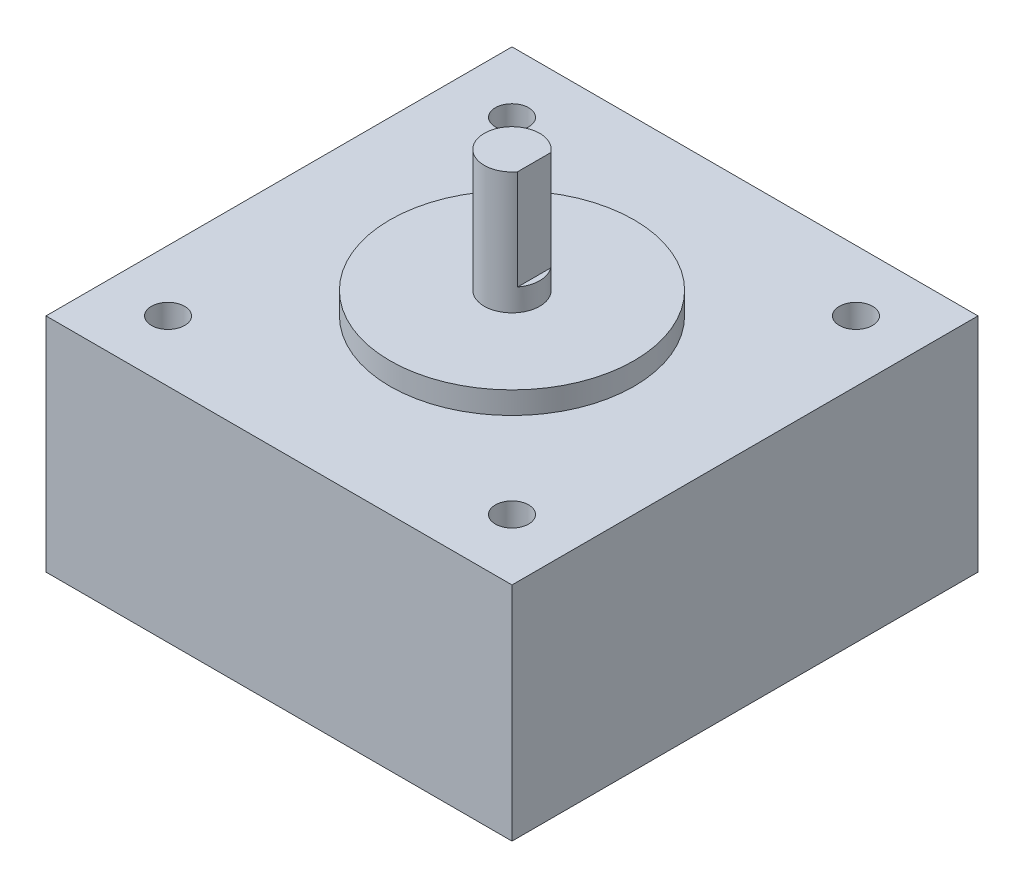
ISO-10303-21;
HEADER;
FILE_DESCRIPTION(('STEP AP214'),'2;1');
FILE_NAME('part.step','',(''),(''),'','','');
FILE_SCHEMA(('AUTOMOTIVE_DESIGN { 1 0 10303 214 1 1 1 1 }'));
ENDSEC;
DATA;
#1=APPLICATION_CONTEXT('core data for automotive mechanical design processes');
#2=APPLICATION_PROTOCOL_DEFINITION('international standard','automotive_design',2000,#1);
#3=PRODUCT_CONTEXT('',#1,'mechanical');
#4=PRODUCT('Part','Part','',(#3));
#5=PRODUCT_RELATED_PRODUCT_CATEGORY('part','',(#4));
#6=PRODUCT_DEFINITION_FORMATION('','',#4);
#7=PRODUCT_DEFINITION_CONTEXT('part definition',#1,'design');
#8=PRODUCT_DEFINITION('design','',#6,#7);
#9=PRODUCT_DEFINITION_SHAPE('','',#8);
#10=(LENGTH_UNIT() NAMED_UNIT(*) SI_UNIT(.MILLI.,.METRE.));
#11=(NAMED_UNIT(*) PLANE_ANGLE_UNIT() SI_UNIT($,.RADIAN.));
#12=(NAMED_UNIT(*) SI_UNIT($,.STERADIAN.) SOLID_ANGLE_UNIT());
#13=UNCERTAINTY_MEASURE_WITH_UNIT(LENGTH_MEASURE(1.E-05),#10,'distance_accuracy_value','');
#14=(GEOMETRIC_REPRESENTATION_CONTEXT(3) GLOBAL_UNCERTAINTY_ASSIGNED_CONTEXT((#13)) GLOBAL_UNIT_ASSIGNED_CONTEXT((#10,
#11,#12)) REPRESENTATION_CONTEXT('',''));
#15=CARTESIAN_POINT('',(0.,0.,0.));
#16=DIRECTION('',(0.,0.,1.));
#17=DIRECTION('',(1.,0.,0.));
#18=AXIS2_PLACEMENT_3D('',#15,#16,#17);
#19=CARTESIAN_POINT('',(21.0000000000001,33.0000000000003,-21.));
#20=DIRECTION('',(0.,-1.,0.));
#21=DIRECTION('',(0.,0.,-1.));
#22=AXIS2_PLACEMENT_3D('',#19,#20,#21);
#23=CYLINDRICAL_SURFACE('',#22,2.5);
#24=CARTESIAN_POINT('',(20.9999999999997,22.0000000000003,-21.));
#25=DIRECTION('',(0.,1.,0.));
#26=DIRECTION('',(0.,0.,1.));
#27=AXIS2_PLACEMENT_3D('',#24,#25,#26);
#28=CIRCLE('',#27,2.5);
#29=CARTESIAN_POINT('',(20.9999999999997,22.0000000000003,-18.5));
#30=VERTEX_POINT('',#29);
#31=EDGE_CURVE('E11',#30,#30,#28,.T.);
#32=ORIENTED_EDGE('',*,*,#31,.T.);
#33=EDGE_LOOP('',(#32));
#34=FACE_BOUND('',#33,.T.);
#35=DIRECTION('',(0.,1.,0.));
#36=VECTOR('',#35,1.);
#37=CARTESIAN_POINT('',(22.9999999999997,24.0000000000001,-19.4999999999999));
#38=LINE('',#37,#36);
#39=CARTESIAN_POINT('',(22.9999999999997,24.0000000000001,-19.4999999999999));
#40=VERTEX_POINT('',#39);
#41=CARTESIAN_POINT('',(23.0000000000004,33.0000000000003,-19.5000000000001));
#42=VERTEX_POINT('',#41);
#43=EDGE_CURVE('E101',#40,#42,#38,.T.);
#44=ORIENTED_EDGE('',*,*,#43,.T.);
#45=CARTESIAN_POINT('',(21.0000000000001,33.0000000000003,-21.));
#46=DIRECTION('',(0.,1.,0.));
#47=DIRECTION('',(0.,0.,1.));
#48=AXIS2_PLACEMENT_3D('',#45,#46,#47);
#49=CIRCLE('',#48,2.5);
#50=CARTESIAN_POINT('',(23.,33.,-22.5));
#51=VERTEX_POINT('',#50);
#52=EDGE_CURVE('E119',#51,#42,#49,.T.);
#53=ORIENTED_EDGE('',*,*,#52,.F.);
#54=DIRECTION('',(0.,1.,0.));
#55=VECTOR('',#54,1.);
#56=CARTESIAN_POINT('',(23.0000000000005,24.0000000000002,-22.5));
#57=LINE('',#56,#55);
#58=CARTESIAN_POINT('',(23.0000000000005,24.0000000000002,-22.5));
#59=VERTEX_POINT('',#58);
#60=EDGE_CURVE('E55',#59,#51,#57,.T.);
#61=ORIENTED_EDGE('',*,*,#60,.F.);
#62=CARTESIAN_POINT('',(21.,24.0000000000004,-21.));
#63=DIRECTION('',(0.,1.,0.));
#64=DIRECTION('',(0.,0.,1.));
#65=AXIS2_PLACEMENT_3D('',#62,#63,#64);
#66=CIRCLE('',#65,2.5);
#67=EDGE_CURVE('E111',#40,#59,#66,.T.);
#68=ORIENTED_EDGE('',*,*,#67,.F.);
#69=EDGE_LOOP('',(#44,#53,#61,#68));
#70=FACE_BOUND('',#69,.T.);
#71=ADVANCED_FACE('F38',(#34,#70),#23,.T.);
#72=CARTESIAN_POINT('',(21.0000000000001,33.0000000000003,-21.));
#73=DIRECTION('',(0.,1.,0.));
#74=DIRECTION('',(0.,0.,1.));
#75=AXIS2_PLACEMENT_3D('',#72,#73,#74);
#76=PLANE('',#75);
#77=ORIENTED_EDGE('',*,*,#52,.T.);
#78=DIRECTION('',(0.,0.,-1.));
#79=VECTOR('',#78,1.);
#80=CARTESIAN_POINT('',(22.9999999999998,33.0000000000001,0.));
#81=LINE('',#80,#79);
#82=EDGE_CURVE('E106',#42,#51,#81,.T.);
#83=ORIENTED_EDGE('',*,*,#82,.T.);
#84=EDGE_LOOP('',(#77,#83));
#85=FACE_BOUND('',#84,.T.);
#86=ADVANCED_FACE('F187',(#85),#76,.T.);
#87=CARTESIAN_POINT('',(3.60822483003176E-13,20.0000000000001,1.80411241501588E-13));
#88=DIRECTION('',(0.,-1.,0.));
#89=DIRECTION('',(0.,0.,-1.));
#90=AXIS2_PLACEMENT_3D('',#87,#88,#89);
#91=PLANE('',#90);
#92=CARTESIAN_POINT('',(21.0000000000001,20.0000000000003,-21.0000000000002));
#93=DIRECTION('',(0.,1.,0.));
#94=DIRECTION('',(0.,0.,1.));
#95=AXIS2_PLACEMENT_3D('',#92,#93,#94);
#96=CIRCLE('',#95,11.);
#97=CARTESIAN_POINT('',(21.0000000000001,20.0000000000003,-10.0000000000002));
#98=VERTEX_POINT('',#97);
#99=EDGE_CURVE('E47',#98,#98,#96,.T.);
#100=ORIENTED_EDGE('',*,*,#99,.F.);
#101=EDGE_LOOP('',(#100));
#102=FACE_BOUND('',#101,.T.);
#103=DIRECTION('',(0.,0.,1.));
#104=VECTOR('',#103,1.);
#105=CARTESIAN_POINT('',(3.60822483003176E-13,20.0000000000001,1.80411241501588E-13));
#106=LINE('',#105,#104);
#107=CARTESIAN_POINT('',(-3.88578058618805E-13,20.0000000000002,-42.0000000000002));
#108=VERTEX_POINT('',#107);
#109=CARTESIAN_POINT('',(3.60822483003176E-13,20.0000000000001,1.80411241501588E-13));
#110=VERTEX_POINT('',#109);
#111=EDGE_CURVE('E152',#108,#110,#106,.T.);
#112=ORIENTED_EDGE('',*,*,#111,.T.);
#113=DIRECTION('',(0.999999999999994,0.,0.));
#114=VECTOR('',#113,1.);
#115=CARTESIAN_POINT('',(3.60822483003176E-13,20.0000000000001,1.80411241501588E-13));
#116=LINE('',#115,#114);
#117=CARTESIAN_POINT('',(41.9999999999997,20.0000000000001,1.2490009027033E-13));
#118=VERTEX_POINT('',#117);
#119=EDGE_CURVE('E93',#110,#118,#116,.T.);
#120=ORIENTED_EDGE('',*,*,#119,.T.);
#121=DIRECTION('',(0.,0.,-1.));
#122=VECTOR('',#121,1.);
#123=CARTESIAN_POINT('',(41.9999999999997,20.0000000000001,1.2490009027033E-13));
#124=LINE('',#123,#122);
#125=CARTESIAN_POINT('',(42.0000000000002,20.0000000000003,-42.0000000000001));
#126=VERTEX_POINT('',#125);
#127=EDGE_CURVE('E155',#118,#126,#124,.T.);
#128=ORIENTED_EDGE('',*,*,#127,.T.);
#129=DIRECTION('',(-0.999999999999994,0.,0.));
#130=VECTOR('',#129,1.);
#131=CARTESIAN_POINT('',(-3.88578058618805E-13,20.0000000000002,-42.0000000000002));
#132=LINE('',#131,#130);
#133=EDGE_CURVE('E64',#126,#108,#132,.T.);
#134=ORIENTED_EDGE('',*,*,#133,.T.);
#135=EDGE_LOOP('',(#112,#120,#128,#134));
#136=FACE_BOUND('',#135,.T.);
#137=CARTESIAN_POINT('',(36.4999999999996,20.0000000000002,-5.49999999999999));
#138=DIRECTION('',(0.,1.,0.));
#139=DIRECTION('',(0.,0.,1.));
#140=AXIS2_PLACEMENT_3D('',#137,#138,#139);
#141=CIRCLE('',#140,1.5);
#142=CARTESIAN_POINT('',(36.4999999999996,20.0000000000002,-3.99999999999999));
#143=VERTEX_POINT('',#142);
#144=EDGE_CURVE('E146',#143,#143,#141,.T.);
#145=ORIENTED_EDGE('',*,*,#144,.F.);
#146=EDGE_LOOP('',(#145));
#147=FACE_BOUND('',#146,.T.);
#148=CARTESIAN_POINT('',(36.4999999999999,20.0000000000002,-36.5000000000002));
#149=DIRECTION('',(0.,1.,0.));
#150=DIRECTION('',(0.,0.,1.));
#151=AXIS2_PLACEMENT_3D('',#148,#149,#150);
#152=CIRCLE('',#151,1.5);
#153=CARTESIAN_POINT('',(36.4999999999999,20.0000000000002,-35.0000000000002));
#154=VERTEX_POINT('',#153);
#155=EDGE_CURVE('E140',#154,#154,#152,.T.);
#156=ORIENTED_EDGE('',*,*,#155,.F.);
#157=EDGE_LOOP('',(#156));
#158=FACE_BOUND('',#157,.T.);
#159=CARTESIAN_POINT('',(5.49999999999987,20.0000000000003,-5.49999999999999));
#160=DIRECTION('',(0.,1.,0.));
#161=DIRECTION('',(0.,0.,1.));
#162=AXIS2_PLACEMENT_3D('',#159,#160,#161);
#163=CIRCLE('',#162,1.5);
#164=CARTESIAN_POINT('',(5.49999999999987,20.0000000000003,-3.99999999999999));
#165=VERTEX_POINT('',#164);
#166=EDGE_CURVE('E134',#165,#165,#163,.T.);
#167=ORIENTED_EDGE('',*,*,#166,.F.);
#168=EDGE_LOOP('',(#167));
#169=FACE_BOUND('',#168,.T.);
#170=CARTESIAN_POINT('',(5.50000000000001,20.0000000000002,-36.5));
#171=DIRECTION('',(0.,1.,0.));
#172=DIRECTION('',(0.,0.,1.));
#173=AXIS2_PLACEMENT_3D('',#170,#171,#172);
#174=CIRCLE('',#173,1.5);
#175=CARTESIAN_POINT('',(5.50000000000001,20.0000000000002,-35.));
#176=VERTEX_POINT('',#175);
#177=EDGE_CURVE('E128',#176,#176,#174,.T.);
#178=ORIENTED_EDGE('',*,*,#177,.F.);
#179=EDGE_LOOP('',(#178));
#180=FACE_BOUND('',#179,.T.);
#181=ADVANCED_FACE('F184',(#102,#136,#147,#158,#169,#180),#91,.F.);
#182=CARTESIAN_POINT('',(0.,0.,0.));
#183=DIRECTION('',(0.,-1.,0.));
#184=DIRECTION('',(0.,0.,-1.));
#185=AXIS2_PLACEMENT_3D('',#182,#183,#184);
#186=PLANE('',#185);
#187=CARTESIAN_POINT('',(5.49999999999967,1.2490009027033E-13,-5.49999999999999));
#188=DIRECTION('',(0.,1.,0.));
#189=DIRECTION('',(0.,0.,1.));
#190=AXIS2_PLACEMENT_3D('',#187,#188,#189);
#191=CIRCLE('',#190,1.5);
#192=CARTESIAN_POINT('',(5.49999999999967,1.24901001254265E-13,-3.99999999999999));
#193=VERTEX_POINT('',#192);
#194=EDGE_CURVE('E131',#193,#193,#191,.T.);
#195=ORIENTED_EDGE('',*,*,#194,.T.);
#196=EDGE_LOOP('',(#195));
#197=FACE_BOUND('',#196,.T.);
#198=CARTESIAN_POINT('',(36.4999999999995,1.80411241501588E-13,-5.5000000000002));
#199=DIRECTION('',(0.,1.,0.));
#200=DIRECTION('',(0.,0.,1.));
#201=AXIS2_PLACEMENT_3D('',#198,#199,#200);
#202=CIRCLE('',#201,1.5);
#203=CARTESIAN_POINT('',(36.4999999999995,1.80412152485523E-13,-4.0000000000002));
#204=VERTEX_POINT('',#203);
#205=EDGE_CURVE('E143',#204,#204,#202,.T.);
#206=ORIENTED_EDGE('',*,*,#205,.T.);
#207=EDGE_LOOP('',(#206));
#208=FACE_BOUND('',#207,.T.);
#209=DIRECTION('',(0.,0.,1.));
#210=VECTOR('',#209,1.);
#211=CARTESIAN_POINT('',(0.,0.,0.));
#212=LINE('',#211,#210);
#213=CARTESIAN_POINT('',(0.,0.,-42.));
#214=VERTEX_POINT('',#213);
#215=CARTESIAN_POINT('',(0.,0.,0.));
#216=VERTEX_POINT('',#215);
#217=EDGE_CURVE('E149',#214,#216,#212,.T.);
#218=ORIENTED_EDGE('',*,*,#217,.F.);
#219=DIRECTION('',(-0.999999999999994,0.,0.));
#220=VECTOR('',#219,1.);
#221=CARTESIAN_POINT('',(0.,0.,-42.));
#222=LINE('',#221,#220);
#223=CARTESIAN_POINT('',(42.0000000000001,1.66533453693773E-13,-42.0000000000001));
#224=VERTEX_POINT('',#223);
#225=EDGE_CURVE('E85',#224,#214,#222,.T.);
#226=ORIENTED_EDGE('',*,*,#225,.F.);
#227=DIRECTION('',(0.,0.,-1.));
#228=VECTOR('',#227,1.);
#229=CARTESIAN_POINT('',(41.9999999999998,2.4980018054066E-13,-3.60822483003176E-13));
#230=LINE('',#229,#228);
#231=CARTESIAN_POINT('',(41.9999999999998,2.4980018054066E-13,-3.60822483003176E-13));
#232=VERTEX_POINT('',#231);
#233=EDGE_CURVE('E163',#232,#224,#230,.T.);
#234=ORIENTED_EDGE('',*,*,#233,.F.);
#235=DIRECTION('',(0.999999999999994,0.,0.));
#236=VECTOR('',#235,1.);
#237=CARTESIAN_POINT('',(0.,0.,0.));
#238=LINE('',#237,#236);
#239=EDGE_CURVE('E161',#216,#232,#238,.T.);
#240=ORIENTED_EDGE('',*,*,#239,.F.);
#241=EDGE_LOOP('',(#218,#226,#234,#240));
#242=FACE_BOUND('',#241,.T.);
#243=CARTESIAN_POINT('',(36.5,0.,-36.5000000000001));
#244=DIRECTION('',(0.,1.,0.));
#245=DIRECTION('',(0.,0.,1.));
#246=AXIS2_PLACEMENT_3D('',#243,#244,#245);
#247=CIRCLE('',#246,1.5);
#248=CARTESIAN_POINT('',(36.5,0.,-35.0000000000001));
#249=VERTEX_POINT('',#248);
#250=EDGE_CURVE('E137',#249,#249,#247,.T.);
#251=ORIENTED_EDGE('',*,*,#250,.T.);
#252=EDGE_LOOP('',(#251));
#253=FACE_BOUND('',#252,.T.);
#254=CARTESIAN_POINT('',(5.50000000000037,1.2490009027033E-13,-36.5000000000002));
#255=DIRECTION('',(0.,1.,0.));
#256=DIRECTION('',(0.,0.,1.));
#257=AXIS2_PLACEMENT_3D('',#254,#255,#256);
#258=CIRCLE('',#257,1.5);
#259=CARTESIAN_POINT('',(5.50000000000037,1.24901001254265E-13,-35.0000000000002));
#260=VERTEX_POINT('',#259);
#261=EDGE_CURVE('E125',#260,#260,#258,.T.);
#262=ORIENTED_EDGE('',*,*,#261,.T.);
#263=EDGE_LOOP('',(#262));
#264=FACE_BOUND('',#263,.T.);
#265=ADVANCED_FACE('F179',(#197,#208,#242,#253,#264),#186,.T.);
#266=CARTESIAN_POINT('',(3.60822483003176E-13,20.0000000000001,1.80411241501588E-13));
#267=DIRECTION('',(0.999999999999994,0.,0.));
#268=DIRECTION('',(0.,0.,-1.));
#269=AXIS2_PLACEMENT_3D('',#266,#267,#268);
#270=PLANE('',#269);
#271=ORIENTED_EDGE('',*,*,#217,.T.);
#272=DIRECTION('',(0.,-1.,0.));
#273=VECTOR('',#272,1.);
#274=CARTESIAN_POINT('',(3.60822483003176E-13,20.0000000000001,1.80411241501588E-13));
#275=LINE('',#274,#273);
#276=EDGE_CURVE('E42',#110,#216,#275,.T.);
#277=ORIENTED_EDGE('',*,*,#276,.F.);
#278=ORIENTED_EDGE('',*,*,#111,.F.);
#279=DIRECTION('',(0.,-1.,0.));
#280=VECTOR('',#279,1.);
#281=CARTESIAN_POINT('',(-3.88578058618805E-13,20.0000000000002,-42.0000000000002));
#282=LINE('',#281,#280);
#283=EDGE_CURVE('E158',#108,#214,#282,.T.);
#284=ORIENTED_EDGE('',*,*,#283,.T.);
#285=EDGE_LOOP('',(#271,#277,#278,#284));
#286=FACE_BOUND('',#285,.T.);
#287=ADVANCED_FACE('F40',(#286),#270,.F.);
#288=CARTESIAN_POINT('',(3.60822483003176E-13,20.0000000000001,1.80411241501588E-13));
#289=DIRECTION('',(0.,0.,-1.));
#290=DIRECTION('',(-0.999999999999994,0.,0.));
#291=AXIS2_PLACEMENT_3D('',#288,#289,#290);
#292=PLANE('',#291);
#293=ORIENTED_EDGE('',*,*,#239,.T.);
#294=DIRECTION('',(0.,-1.,0.));
#295=VECTOR('',#294,1.);
#296=CARTESIAN_POINT('',(41.9999999999997,20.0000000000001,1.2490009027033E-13));
#297=LINE('',#296,#295);
#298=EDGE_CURVE('E168',#118,#232,#297,.T.);
#299=ORIENTED_EDGE('',*,*,#298,.F.);
#300=ORIENTED_EDGE('',*,*,#119,.F.);
#301=ORIENTED_EDGE('',*,*,#276,.T.);
#302=EDGE_LOOP('',(#293,#299,#300,#301));
#303=FACE_BOUND('',#302,.T.);
#304=ADVANCED_FACE('F174',(#303),#292,.F.);
#305=CARTESIAN_POINT('',(41.9999999999997,20.0000000000001,1.2490009027033E-13));
#306=DIRECTION('',(-0.999999999999994,0.,0.));
#307=DIRECTION('',(0.,0.,1.));
#308=AXIS2_PLACEMENT_3D('',#305,#306,#307);
#309=PLANE('',#308);
#310=ORIENTED_EDGE('',*,*,#233,.T.);
#311=DIRECTION('',(0.,-1.,0.));
#312=VECTOR('',#311,1.);
#313=CARTESIAN_POINT('',(42.0000000000002,20.0000000000003,-42.0000000000001));
#314=LINE('',#313,#312);
#315=EDGE_CURVE('E167',#126,#224,#314,.T.);
#316=ORIENTED_EDGE('',*,*,#315,.F.);
#317=ORIENTED_EDGE('',*,*,#127,.F.);
#318=ORIENTED_EDGE('',*,*,#298,.T.);
#319=EDGE_LOOP('',(#310,#316,#317,#318));
#320=FACE_BOUND('',#319,.T.);
#321=ADVANCED_FACE('F182',(#320),#309,.F.);
#322=CARTESIAN_POINT('',(-3.88578058618805E-13,20.0000000000002,-42.0000000000002));
#323=DIRECTION('',(0.,0.,1.));
#324=DIRECTION('',(0.999999999999994,0.,0.));
#325=AXIS2_PLACEMENT_3D('',#322,#323,#324);
#326=PLANE('',#325);
#327=ORIENTED_EDGE('',*,*,#225,.T.);
#328=ORIENTED_EDGE('',*,*,#283,.F.);
#329=ORIENTED_EDGE('',*,*,#133,.F.);
#330=ORIENTED_EDGE('',*,*,#315,.T.);
#331=EDGE_LOOP('',(#327,#328,#329,#330));
#332=FACE_BOUND('',#331,.T.);
#333=ADVANCED_FACE('F183',(#332),#326,.F.);
#334=CARTESIAN_POINT('',(36.4999999999996,20.0000000000002,-5.49999999999999));
#335=DIRECTION('',(0.,-1.,0.));
#336=DIRECTION('',(0.,0.,-1.));
#337=AXIS2_PLACEMENT_3D('',#334,#335,#336);
#338=CYLINDRICAL_SURFACE('',#337,1.5);
#339=ORIENTED_EDGE('',*,*,#144,.T.);
#340=EDGE_LOOP('',(#339));
#341=FACE_BOUND('',#340,.T.);
#342=ORIENTED_EDGE('',*,*,#205,.F.);
#343=EDGE_LOOP('',(#342));
#344=FACE_BOUND('',#343,.T.);
#345=ADVANCED_FACE('F237',(#341,#344),#338,.F.);
#346=CARTESIAN_POINT('',(36.4999999999999,20.0000000000002,-36.5000000000002));
#347=DIRECTION('',(0.,-1.,0.));
#348=DIRECTION('',(0.,0.,-1.));
#349=AXIS2_PLACEMENT_3D('',#346,#347,#348);
#350=CYLINDRICAL_SURFACE('',#349,1.5);
#351=ORIENTED_EDGE('',*,*,#155,.T.);
#352=EDGE_LOOP('',(#351));
#353=FACE_BOUND('',#352,.T.);
#354=ORIENTED_EDGE('',*,*,#250,.F.);
#355=EDGE_LOOP('',(#354));
#356=FACE_BOUND('',#355,.T.);
#357=ADVANCED_FACE('F233',(#353,#356),#350,.F.);
#358=CARTESIAN_POINT('',(5.49999999999987,20.0000000000003,-5.49999999999999));
#359=DIRECTION('',(0.,-1.,0.));
#360=DIRECTION('',(0.,0.,-1.));
#361=AXIS2_PLACEMENT_3D('',#358,#359,#360);
#362=CYLINDRICAL_SURFACE('',#361,1.5);
#363=ORIENTED_EDGE('',*,*,#166,.T.);
#364=EDGE_LOOP('',(#363));
#365=FACE_BOUND('',#364,.T.);
#366=ORIENTED_EDGE('',*,*,#194,.F.);
#367=EDGE_LOOP('',(#366));
#368=FACE_BOUND('',#367,.T.);
#369=ADVANCED_FACE('F202',(#365,#368),#362,.F.);
#370=CARTESIAN_POINT('',(5.50000000000001,20.0000000000002,-36.5));
#371=DIRECTION('',(0.,-1.,0.));
#372=DIRECTION('',(0.,0.,-1.));
#373=AXIS2_PLACEMENT_3D('',#370,#371,#372);
#374=CYLINDRICAL_SURFACE('',#373,1.5);
#375=ORIENTED_EDGE('',*,*,#177,.T.);
#376=EDGE_LOOP('',(#375));
#377=FACE_BOUND('',#376,.T.);
#378=ORIENTED_EDGE('',*,*,#261,.F.);
#379=EDGE_LOOP('',(#378));
#380=FACE_BOUND('',#379,.T.);
#381=ADVANCED_FACE('F198',(#377,#380),#374,.F.);
#382=CARTESIAN_POINT('',(20.9999999999997,22.0000000000003,-21.));
#383=DIRECTION('',(0.,-1.,0.));
#384=DIRECTION('',(0.,0.,-1.));
#385=AXIS2_PLACEMENT_3D('',#382,#383,#384);
#386=CYLINDRICAL_SURFACE('',#385,11.);
#387=CARTESIAN_POINT('',(20.9999999999997,22.0000000000003,-21.));
#388=DIRECTION('',(0.,1.,0.));
#389=DIRECTION('',(0.,0.,1.));
#390=AXIS2_PLACEMENT_3D('',#387,#388,#389);
#391=CIRCLE('',#390,11.);
#392=CARTESIAN_POINT('',(20.9999999999997,22.0000000000003,-10.));
#393=VERTEX_POINT('',#392);
#394=EDGE_CURVE('E121',#393,#393,#391,.T.);
#395=ORIENTED_EDGE('',*,*,#394,.F.);
#396=EDGE_LOOP('',(#395));
#397=FACE_BOUND('',#396,.T.);
#398=ORIENTED_EDGE('',*,*,#99,.T.);
#399=EDGE_LOOP('',(#398));
#400=FACE_BOUND('',#399,.T.);
#401=ADVANCED_FACE('F201',(#397,#400),#386,.T.);
#402=CARTESIAN_POINT('',(20.9999999999997,22.0000000000003,-21.));
#403=DIRECTION('',(0.,1.,0.));
#404=DIRECTION('',(0.,0.,1.));
#405=AXIS2_PLACEMENT_3D('',#402,#403,#404);
#406=PLANE('',#405);
#407=ORIENTED_EDGE('',*,*,#31,.F.);
#408=EDGE_LOOP('',(#407));
#409=FACE_BOUND('',#408,.T.);
#410=ORIENTED_EDGE('',*,*,#394,.T.);
#411=EDGE_LOOP('',(#410));
#412=FACE_BOUND('',#411,.T.);
#413=ADVANCED_FACE('F224',(#409,#412),#406,.T.);
#414=CARTESIAN_POINT('',(23.0000000000001,24.0000000000002,1.80411241501588E-13));
#415=DIRECTION('',(0.999999999999994,0.,0.));
#416=DIRECTION('',(0.,0.,-1.));
#417=AXIS2_PLACEMENT_3D('',#414,#415,#416);
#418=PLANE('',#417);
#419=ORIENTED_EDGE('',*,*,#82,.F.);
#420=ORIENTED_EDGE('',*,*,#43,.F.);
#421=DIRECTION('',(0.,0.,-1.));
#422=VECTOR('',#421,1.);
#423=CARTESIAN_POINT('',(23.0000000000001,24.0000000000002,1.80411241501588E-13));
#424=LINE('',#423,#422);
#425=EDGE_CURVE('E104',#40,#59,#424,.T.);
#426=ORIENTED_EDGE('',*,*,#425,.T.);
#427=ORIENTED_EDGE('',*,*,#60,.T.);
#428=EDGE_LOOP('',(#419,#420,#426,#427));
#429=FACE_BOUND('',#428,.T.);
#430=ADVANCED_FACE('F103',(#429),#418,.T.);
#431=CARTESIAN_POINT('',(-1.94289029309402E-13,24.0000000000003,0.));
#432=DIRECTION('',(0.,1.,0.));
#433=DIRECTION('',(0.,0.,1.));
#434=AXIS2_PLACEMENT_3D('',#431,#432,#433);
#435=PLANE('',#434);
#436=ORIENTED_EDGE('',*,*,#425,.F.);
#437=ORIENTED_EDGE('',*,*,#67,.T.);
#438=EDGE_LOOP('',(#436,#437));
#439=FACE_BOUND('',#438,.T.);
#440=ADVANCED_FACE('F114',(#439),#435,.T.);
#441=CLOSED_SHELL('',(#71,#86,#181,#265,#287,#304,#321,#333,#345,#357,#369,#381,#401,#413,#430,#440));
#442=MANIFOLD_SOLID_BREP('B2',#441);
#443=ADVANCED_BREP_SHAPE_REPRESENTATION('',(#18,#442),#14);
#444=SHAPE_DEFINITION_REPRESENTATION(#9,#443);
ENDSEC;
END-ISO-10303-21;
